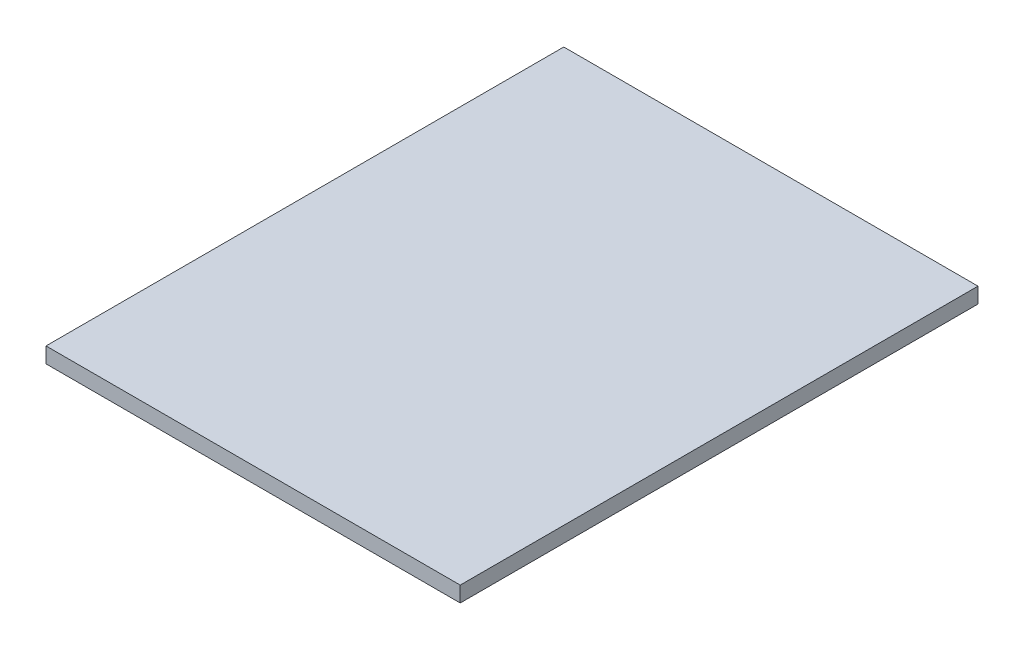
ISO-10303-21;
HEADER;
FILE_DESCRIPTION(('STEP AP214'),'2;1');
FILE_NAME('part.step','',(''),(''),'','','');
FILE_SCHEMA(('AUTOMOTIVE_DESIGN { 1 0 10303 214 1 1 1 1 }'));
ENDSEC;
DATA;
#1=APPLICATION_CONTEXT('core data for automotive mechanical design processes');
#2=APPLICATION_PROTOCOL_DEFINITION('international standard','automotive_design',2000,#1);
#3=PRODUCT_CONTEXT('',#1,'mechanical');
#4=PRODUCT('Part','Part','',(#3));
#5=PRODUCT_RELATED_PRODUCT_CATEGORY('part','',(#4));
#6=PRODUCT_DEFINITION_FORMATION('','',#4);
#7=PRODUCT_DEFINITION_CONTEXT('part definition',#1,'design');
#8=PRODUCT_DEFINITION('design','',#6,#7);
#9=PRODUCT_DEFINITION_SHAPE('','',#8);
#10=(LENGTH_UNIT() NAMED_UNIT(*) SI_UNIT(.MILLI.,.METRE.));
#11=(NAMED_UNIT(*) PLANE_ANGLE_UNIT() SI_UNIT($,.RADIAN.));
#12=(NAMED_UNIT(*) SI_UNIT($,.STERADIAN.) SOLID_ANGLE_UNIT());
#13=UNCERTAINTY_MEASURE_WITH_UNIT(LENGTH_MEASURE(1.E-05),#10,'distance_accuracy_value','');
#14=(GEOMETRIC_REPRESENTATION_CONTEXT(3) GLOBAL_UNCERTAINTY_ASSIGNED_CONTEXT((#13)) GLOBAL_UNIT_ASSIGNED_CONTEXT((#10,
#11,#12)) REPRESENTATION_CONTEXT('',''));
#15=CARTESIAN_POINT('',(0.,0.,0.));
#16=DIRECTION('',(0.,0.,1.));
#17=DIRECTION('',(1.,0.,0.));
#18=AXIS2_PLACEMENT_3D('',#15,#16,#17);
#19=CARTESIAN_POINT('',(0.400000000000001,0.75,-10.5));
#20=DIRECTION('',(1.,0.,0.));
#21=DIRECTION('',(0.,0.,-1.));
#22=AXIS2_PLACEMENT_3D('',#19,#20,#21);
#23=PLANE('',#22);
#24=DIRECTION('',(0.,0.,1.));
#25=VECTOR('',#24,1.);
#26=CARTESIAN_POINT('',(0.400000000000001,0.,-10.5));
#27=LINE('',#26,#25);
#28=CARTESIAN_POINT('',(0.400000000000001,0.,-10.5));
#29=VERTEX_POINT('',#28);
#30=CARTESIAN_POINT('',(0.400000000000001,0.,14.5));
#31=VERTEX_POINT('',#30);
#32=EDGE_CURVE('E96',#29,#31,#27,.T.);
#33=ORIENTED_EDGE('',*,*,#32,.T.);
#34=DIRECTION('',(0.,-1.,0.));
#35=VECTOR('',#34,1.);
#36=CARTESIAN_POINT('',(0.400000000000001,0.75,14.5));
#37=LINE('',#36,#35);
#38=CARTESIAN_POINT('',(0.400000000000001,0.75,14.5));
#39=VERTEX_POINT('',#38);
#40=EDGE_CURVE('E11',#39,#31,#37,.T.);
#41=ORIENTED_EDGE('',*,*,#40,.F.);
#42=DIRECTION('',(0.,0.,1.));
#43=VECTOR('',#42,1.);
#44=CARTESIAN_POINT('',(0.400000000000001,0.75,-10.5));
#45=LINE('',#44,#43);
#46=CARTESIAN_POINT('',(0.400000000000001,0.75,-10.5));
#47=VERTEX_POINT('',#46);
#48=EDGE_CURVE('E82',#47,#39,#45,.T.);
#49=ORIENTED_EDGE('',*,*,#48,.F.);
#50=DIRECTION('',(0.,-1.,0.));
#51=VECTOR('',#50,1.);
#52=CARTESIAN_POINT('',(0.400000000000001,0.75,-10.5));
#53=LINE('',#52,#51);
#54=EDGE_CURVE('E49',#47,#29,#53,.T.);
#55=ORIENTED_EDGE('',*,*,#54,.T.);
#56=EDGE_LOOP('',(#33,#41,#49,#55));
#57=FACE_BOUND('',#56,.T.);
#58=ADVANCED_FACE('F33',(#57),#23,.F.);
#59=CARTESIAN_POINT('',(0.400000000000001,0.75,14.5));
#60=DIRECTION('',(0.,0.,-1.));
#61=DIRECTION('',(-1.,0.,0.));
#62=AXIS2_PLACEMENT_3D('',#59,#60,#61);
#63=PLANE('',#62);
#64=DIRECTION('',(1.,0.,0.));
#65=VECTOR('',#64,1.);
#66=CARTESIAN_POINT('',(0.400000000000001,0.,14.5));
#67=LINE('',#66,#65);
#68=CARTESIAN_POINT('',(20.4,0.,14.5));
#69=VERTEX_POINT('',#68);
#70=EDGE_CURVE('E87',#31,#69,#67,.T.);
#71=ORIENTED_EDGE('',*,*,#70,.T.);
#72=DIRECTION('',(0.,-1.,0.));
#73=VECTOR('',#72,1.);
#74=CARTESIAN_POINT('',(20.4,0.75,14.5));
#75=LINE('',#74,#73);
#76=CARTESIAN_POINT('',(20.4,0.75,14.5));
#77=VERTEX_POINT('',#76);
#78=EDGE_CURVE('E41',#77,#69,#75,.T.);
#79=ORIENTED_EDGE('',*,*,#78,.F.);
#80=DIRECTION('',(1.,0.,0.));
#81=VECTOR('',#80,1.);
#82=CARTESIAN_POINT('',(0.400000000000001,0.75,14.5));
#83=LINE('',#82,#81);
#84=EDGE_CURVE('E74',#39,#77,#83,.T.);
#85=ORIENTED_EDGE('',*,*,#84,.F.);
#86=ORIENTED_EDGE('',*,*,#40,.T.);
#87=EDGE_LOOP('',(#71,#79,#85,#86));
#88=FACE_BOUND('',#87,.T.);
#89=ADVANCED_FACE('F86',(#88),#63,.F.);
#90=CARTESIAN_POINT('',(20.4,0.75,-10.5));
#91=DIRECTION('',(1.,0.,0.));
#92=DIRECTION('',(0.,0.,-1.));
#93=AXIS2_PLACEMENT_3D('',#90,#91,#92);
#94=PLANE('',#93);
#95=DIRECTION('',(0.,0.,1.));
#96=VECTOR('',#95,1.);
#97=CARTESIAN_POINT('',(20.4,0.,-10.5));
#98=LINE('',#97,#96);
#99=CARTESIAN_POINT('',(20.4,0.,-10.5));
#100=VERTEX_POINT('',#99);
#101=EDGE_CURVE('E99',#100,#69,#98,.T.);
#102=ORIENTED_EDGE('',*,*,#101,.F.);
#103=DIRECTION('',(0.,-1.,0.));
#104=VECTOR('',#103,1.);
#105=CARTESIAN_POINT('',(20.4,0.75,-10.5));
#106=LINE('',#105,#104);
#107=CARTESIAN_POINT('',(20.4,0.75,-10.5));
#108=VERTEX_POINT('',#107);
#109=EDGE_CURVE('E63',#108,#100,#106,.T.);
#110=ORIENTED_EDGE('',*,*,#109,.F.);
#111=DIRECTION('',(0.,0.,1.));
#112=VECTOR('',#111,1.);
#113=CARTESIAN_POINT('',(20.4,0.75,-10.5));
#114=LINE('',#113,#112);
#115=EDGE_CURVE('E81',#108,#77,#114,.T.);
#116=ORIENTED_EDGE('',*,*,#115,.T.);
#117=ORIENTED_EDGE('',*,*,#78,.T.);
#118=EDGE_LOOP('',(#102,#110,#116,#117));
#119=FACE_BOUND('',#118,.T.);
#120=ADVANCED_FACE('F90',(#119),#94,.T.);
#121=CARTESIAN_POINT('',(0.400000000000001,0.75,-10.5));
#122=DIRECTION('',(0.,0.,-1.));
#123=DIRECTION('',(-1.,0.,0.));
#124=AXIS2_PLACEMENT_3D('',#121,#122,#123);
#125=PLANE('',#124);
#126=DIRECTION('',(1.,0.,0.));
#127=VECTOR('',#126,1.);
#128=CARTESIAN_POINT('',(0.400000000000001,0.,-10.5));
#129=LINE('',#128,#127);
#130=EDGE_CURVE('E101',#29,#100,#129,.T.);
#131=ORIENTED_EDGE('',*,*,#130,.F.);
#132=ORIENTED_EDGE('',*,*,#54,.F.);
#133=DIRECTION('',(1.,0.,0.));
#134=VECTOR('',#133,1.);
#135=CARTESIAN_POINT('',(0.400000000000001,0.75,-10.5));
#136=LINE('',#135,#134);
#137=EDGE_CURVE('E91',#47,#108,#136,.T.);
#138=ORIENTED_EDGE('',*,*,#137,.T.);
#139=ORIENTED_EDGE('',*,*,#109,.T.);
#140=EDGE_LOOP('',(#131,#132,#138,#139));
#141=FACE_BOUND('',#140,.T.);
#142=ADVANCED_FACE('F107',(#141),#125,.T.);
#143=CARTESIAN_POINT('',(0.,0.75,0.));
#144=DIRECTION('',(0.,1.,0.));
#145=DIRECTION('',(0.,0.,1.));
#146=AXIS2_PLACEMENT_3D('',#143,#144,#145);
#147=PLANE('',#146);
#148=ORIENTED_EDGE('',*,*,#48,.T.);
#149=ORIENTED_EDGE('',*,*,#84,.T.);
#150=ORIENTED_EDGE('',*,*,#115,.F.);
#151=ORIENTED_EDGE('',*,*,#137,.F.);
#152=EDGE_LOOP('',(#148,#149,#150,#151));
#153=FACE_BOUND('',#152,.T.);
#154=ADVANCED_FACE('F78',(#153),#147,.T.);
#155=CARTESIAN_POINT('',(0.,0.,0.));
#156=DIRECTION('',(0.,1.,0.));
#157=DIRECTION('',(0.,0.,1.));
#158=AXIS2_PLACEMENT_3D('',#155,#156,#157);
#159=PLANE('',#158);
#160=ORIENTED_EDGE('',*,*,#32,.F.);
#161=ORIENTED_EDGE('',*,*,#130,.T.);
#162=ORIENTED_EDGE('',*,*,#101,.T.);
#163=ORIENTED_EDGE('',*,*,#70,.F.);
#164=EDGE_LOOP('',(#160,#161,#162,#163));
#165=FACE_BOUND('',#164,.T.);
#166=ADVANCED_FACE('F106',(#165),#159,.F.);
#167=CLOSED_SHELL('',(#58,#89,#120,#142,#154,#166));
#168=MANIFOLD_SOLID_BREP('B2',#167);
#169=ADVANCED_BREP_SHAPE_REPRESENTATION('',(#18,#168),#14);
#170=SHAPE_DEFINITION_REPRESENTATION(#9,#169);
ENDSEC;
END-ISO-10303-21;
